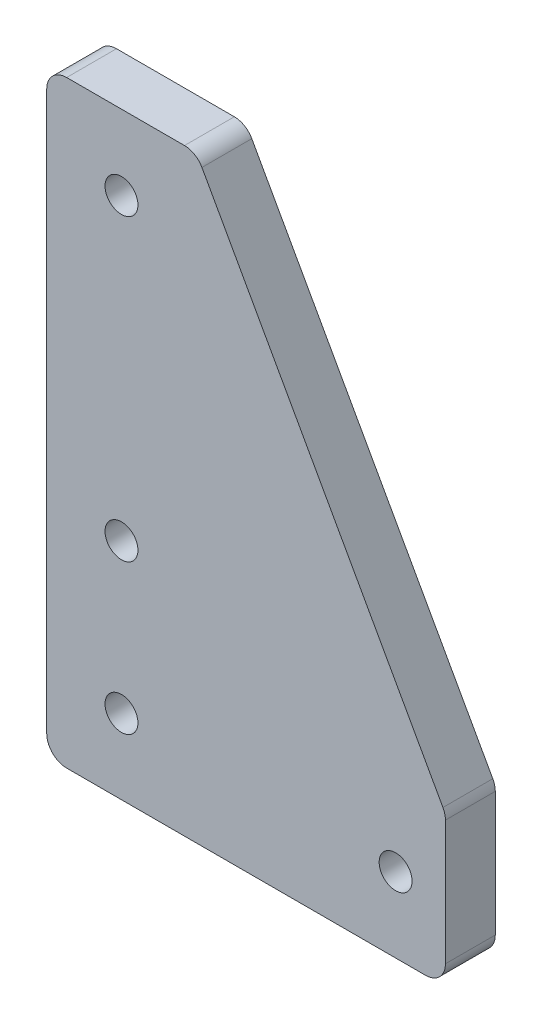
ISO-10303-21;
HEADER;
FILE_DESCRIPTION(('STEP AP214'),'2;1');
FILE_NAME('part.step','',(''),(''),'','','');
FILE_SCHEMA(('AUTOMOTIVE_DESIGN { 1 0 10303 214 1 1 1 1 }'));
ENDSEC;
DATA;
#1=APPLICATION_CONTEXT('core data for automotive mechanical design processes');
#2=APPLICATION_PROTOCOL_DEFINITION('international standard','automotive_design',2000,#1);
#3=PRODUCT_CONTEXT('',#1,'mechanical');
#4=PRODUCT('Part','Part','',(#3));
#5=PRODUCT_RELATED_PRODUCT_CATEGORY('part','',(#4));
#6=PRODUCT_DEFINITION_FORMATION('','',#4);
#7=PRODUCT_DEFINITION_CONTEXT('part definition',#1,'design');
#8=PRODUCT_DEFINITION('design','',#6,#7);
#9=PRODUCT_DEFINITION_SHAPE('','',#8);
#10=(LENGTH_UNIT() NAMED_UNIT(*) SI_UNIT(.MILLI.,.METRE.));
#11=(NAMED_UNIT(*) PLANE_ANGLE_UNIT() SI_UNIT($,.RADIAN.));
#12=(NAMED_UNIT(*) SI_UNIT($,.STERADIAN.) SOLID_ANGLE_UNIT());
#13=UNCERTAINTY_MEASURE_WITH_UNIT(LENGTH_MEASURE(1.E-05),#10,'distance_accuracy_value','');
#14=(GEOMETRIC_REPRESENTATION_CONTEXT(3) GLOBAL_UNCERTAINTY_ASSIGNED_CONTEXT((#13)) GLOBAL_UNIT_ASSIGNED_CONTEXT((#10,
#11,#12)) REPRESENTATION_CONTEXT('',''));
#15=CARTESIAN_POINT('',(0.,0.,0.));
#16=DIRECTION('',(0.,0.,1.));
#17=DIRECTION('',(1.,0.,0.));
#18=AXIS2_PLACEMENT_3D('',#15,#16,#17);
#19=CARTESIAN_POINT('',(0.,0.,5.));
#20=DIRECTION('',(0.,0.,1.));
#21=DIRECTION('',(1.,0.,0.));
#22=AXIS2_PLACEMENT_3D('',#19,#20,#21);
#23=PLANE('',#22);
#24=CARTESIAN_POINT('',(7.50000000000001,22.5,5.));
#25=DIRECTION('',(0.,0.,1.));
#26=DIRECTION('',(1.,0.,0.));
#27=AXIS2_PLACEMENT_3D('',#24,#25,#26);
#28=CIRCLE('',#27,1.65);
#29=CARTESIAN_POINT('',(9.15000000000001,22.5,5.));
#30=VERTEX_POINT('',#29);
#31=EDGE_CURVE('E214',#30,#30,#28,.T.);
#32=ORIENTED_EDGE('',*,*,#31,.F.);
#33=EDGE_LOOP('',(#32));
#34=FACE_BOUND('',#33,.T.);
#35=CARTESIAN_POINT('',(35.,7.5,5.));
#36=DIRECTION('',(0.,0.,1.));
#37=DIRECTION('',(1.,0.,0.));
#38=AXIS2_PLACEMENT_3D('',#35,#36,#37);
#39=CIRCLE('',#38,1.65);
#40=CARTESIAN_POINT('',(36.65,7.5,5.));
#41=VERTEX_POINT('',#40);
#42=EDGE_CURVE('E144',#41,#41,#39,.T.);
#43=ORIENTED_EDGE('',*,*,#42,.F.);
#44=EDGE_LOOP('',(#43));
#45=FACE_BOUND('',#44,.T.);
#46=DIRECTION('',(0.,-1.,0.));
#47=VECTOR('',#46,1.);
#48=CARTESIAN_POINT('',(0.,60.,5.));
#49=LINE('',#48,#47);
#50=CARTESIAN_POINT('',(0.,58.,5.));
#51=VERTEX_POINT('',#50);
#52=CARTESIAN_POINT('',(0.,2.,5.));
#53=VERTEX_POINT('',#52);
#54=EDGE_CURVE('E152',#51,#53,#49,.T.);
#55=ORIENTED_EDGE('',*,*,#54,.T.);
#56=CARTESIAN_POINT('',(2.,2.,5.));
#57=DIRECTION('',(0.,0.,1.));
#58=DIRECTION('',(1.,0.,0.));
#59=AXIS2_PLACEMENT_3D('',#56,#57,#58);
#60=CIRCLE('',#59,2.);
#61=CARTESIAN_POINT('',(2.,0.,5.));
#62=VERTEX_POINT('',#61);
#63=EDGE_CURVE('E171',#53,#62,#60,.T.);
#64=ORIENTED_EDGE('',*,*,#63,.T.);
#65=DIRECTION('',(1.,0.,0.));
#66=VECTOR('',#65,1.);
#67=CARTESIAN_POINT('',(0.,0.,5.));
#68=LINE('',#67,#66);
#69=CARTESIAN_POINT('',(38.,0.,5.));
#70=VERTEX_POINT('',#69);
#71=EDGE_CURVE('E131',#62,#70,#68,.T.);
#72=ORIENTED_EDGE('',*,*,#71,.T.);
#73=CARTESIAN_POINT('',(38.,2.,5.));
#74=DIRECTION('',(0.,0.,1.));
#75=DIRECTION('',(1.,0.,0.));
#76=AXIS2_PLACEMENT_3D('',#73,#74,#75);
#77=CIRCLE('',#76,2.);
#78=CARTESIAN_POINT('',(40.,2.,5.));
#79=VERTEX_POINT('',#78);
#80=EDGE_CURVE('E169',#70,#79,#77,.T.);
#81=ORIENTED_EDGE('',*,*,#80,.T.);
#82=DIRECTION('',(0.,1.,0.));
#83=VECTOR('',#82,1.);
#84=CARTESIAN_POINT('',(40.,0.,5.));
#85=LINE('',#84,#83);
#86=CARTESIAN_POINT('',(40.,14.4817479436052,5.));
#87=VERTEX_POINT('',#86);
#88=EDGE_CURVE('E197',#79,#87,#85,.T.);
#89=ORIENTED_EDGE('',*,*,#88,.T.);
#90=CARTESIAN_POINT('',(38.,14.4817479436052,5.));
#91=DIRECTION('',(0.,0.,1.));
#92=DIRECTION('',(1.,0.,0.));
#93=AXIS2_PLACEMENT_3D('',#90,#91,#92);
#94=CIRCLE('',#93,2.);
#95=CARTESIAN_POINT('',(39.7483145522431,15.4530338059625,5.));
#96=VERTEX_POINT('',#95);
#97=EDGE_CURVE('E167',#87,#96,#94,.T.);
#98=ORIENTED_EDGE('',*,*,#97,.T.);
#99=DIRECTION('',(-0.485642931178632,0.874157276121538,0.));
#100=VECTOR('',#99,1.);
#101=CARTESIAN_POINT('',(40.,15.,5.));
#102=LINE('',#101,#100);
#103=CARTESIAN_POINT('',(15.571507854246,58.9712858623573,5.));
#104=VERTEX_POINT('',#103);
#105=EDGE_CURVE('E188',#96,#104,#102,.T.);
#106=ORIENTED_EDGE('',*,*,#105,.T.);
#107=CARTESIAN_POINT('',(13.8231933020029,58.,5.));
#108=DIRECTION('',(0.,0.,1.));
#109=DIRECTION('',(1.,0.,0.));
#110=AXIS2_PLACEMENT_3D('',#107,#108,#109);
#111=CIRCLE('',#110,2.);
#112=CARTESIAN_POINT('',(13.8231933020029,60.,5.));
#113=VERTEX_POINT('',#112);
#114=EDGE_CURVE('E54',#104,#113,#111,.T.);
#115=ORIENTED_EDGE('',*,*,#114,.T.);
#116=DIRECTION('',(-1.,0.,0.));
#117=VECTOR('',#116,1.);
#118=CARTESIAN_POINT('',(15.,60.,5.));
#119=LINE('',#118,#117);
#120=CARTESIAN_POINT('',(2.,60.,5.));
#121=VERTEX_POINT('',#120);
#122=EDGE_CURVE('E153',#113,#121,#119,.T.);
#123=ORIENTED_EDGE('',*,*,#122,.T.);
#124=CARTESIAN_POINT('',(2.,58.,5.));
#125=DIRECTION('',(0.,0.,1.));
#126=DIRECTION('',(1.,0.,0.));
#127=AXIS2_PLACEMENT_3D('',#124,#125,#126);
#128=CIRCLE('',#127,2.);
#129=EDGE_CURVE('E164',#121,#51,#128,.T.);
#130=ORIENTED_EDGE('',*,*,#129,.T.);
#131=EDGE_LOOP('',(#55,#64,#72,#81,#89,#98,#106,#115,#123,#130));
#132=FACE_BOUND('',#131,.T.);
#133=CARTESIAN_POINT('',(7.5,7.5,5.));
#134=DIRECTION('',(0.,0.,1.));
#135=DIRECTION('',(1.,0.,0.));
#136=AXIS2_PLACEMENT_3D('',#133,#134,#135);
#137=CIRCLE('',#136,1.65);
#138=CARTESIAN_POINT('',(9.15,7.5,5.));
#139=VERTEX_POINT('',#138);
#140=EDGE_CURVE('E208',#139,#139,#137,.T.);
#141=ORIENTED_EDGE('',*,*,#140,.F.);
#142=EDGE_LOOP('',(#141));
#143=FACE_BOUND('',#142,.T.);
#144=CARTESIAN_POINT('',(7.5,52.5,5.));
#145=DIRECTION('',(0.,0.,1.));
#146=DIRECTION('',(1.,0.,0.));
#147=AXIS2_PLACEMENT_3D('',#144,#145,#146);
#148=CIRCLE('',#147,1.65);
#149=CARTESIAN_POINT('',(9.15,52.5,5.));
#150=VERTEX_POINT('',#149);
#151=EDGE_CURVE('E220',#150,#150,#148,.T.);
#152=ORIENTED_EDGE('',*,*,#151,.F.);
#153=EDGE_LOOP('',(#152));
#154=FACE_BOUND('',#153,.T.);
#155=ADVANCED_FACE('F33',(#34,#45,#132,#143,#154),#23,.T.);
#156=CARTESIAN_POINT('',(0.,0.,0.));
#157=DIRECTION('',(0.,0.,1.));
#158=DIRECTION('',(1.,0.,0.));
#159=AXIS2_PLACEMENT_3D('',#156,#157,#158);
#160=PLANE('',#159);
#161=DIRECTION('',(1.,0.,0.));
#162=VECTOR('',#161,1.);
#163=CARTESIAN_POINT('',(0.,0.,0.));
#164=LINE('',#163,#162);
#165=CARTESIAN_POINT('',(2.,0.,0.));
#166=VERTEX_POINT('',#165);
#167=CARTESIAN_POINT('',(38.,0.,0.));
#168=VERTEX_POINT('',#167);
#169=EDGE_CURVE('E128',#166,#168,#164,.T.);
#170=ORIENTED_EDGE('',*,*,#169,.F.);
#171=CARTESIAN_POINT('',(2.,2.,0.));
#172=DIRECTION('',(0.,0.,1.));
#173=DIRECTION('',(1.,0.,0.));
#174=AXIS2_PLACEMENT_3D('',#171,#172,#173);
#175=CIRCLE('',#174,2.);
#176=CARTESIAN_POINT('',(0.,2.,0.));
#177=VERTEX_POINT('',#176);
#178=EDGE_CURVE('E111',#166,#177,#175,.F.);
#179=ORIENTED_EDGE('',*,*,#178,.T.);
#180=DIRECTION('',(0.,-1.,0.));
#181=VECTOR('',#180,1.);
#182=CARTESIAN_POINT('',(0.,60.,0.));
#183=LINE('',#182,#181);
#184=CARTESIAN_POINT('',(0.,58.,0.));
#185=VERTEX_POINT('',#184);
#186=EDGE_CURVE('E139',#185,#177,#183,.T.);
#187=ORIENTED_EDGE('',*,*,#186,.F.);
#188=CARTESIAN_POINT('',(2.,58.,0.));
#189=DIRECTION('',(0.,0.,1.));
#190=DIRECTION('',(1.,0.,0.));
#191=AXIS2_PLACEMENT_3D('',#188,#189,#190);
#192=CIRCLE('',#191,2.);
#193=CARTESIAN_POINT('',(2.,60.,0.));
#194=VERTEX_POINT('',#193);
#195=EDGE_CURVE('E132',#185,#194,#192,.F.);
#196=ORIENTED_EDGE('',*,*,#195,.T.);
#197=DIRECTION('',(-1.,0.,0.));
#198=VECTOR('',#197,1.);
#199=CARTESIAN_POINT('',(15.,60.,0.));
#200=LINE('',#199,#198);
#201=CARTESIAN_POINT('',(13.8231933020029,60.,0.));
#202=VERTEX_POINT('',#201);
#203=EDGE_CURVE('E150',#202,#194,#200,.T.);
#204=ORIENTED_EDGE('',*,*,#203,.F.);
#205=CARTESIAN_POINT('',(13.8231933020029,58.,0.));
#206=DIRECTION('',(0.,0.,1.));
#207=DIRECTION('',(1.,0.,0.));
#208=AXIS2_PLACEMENT_3D('',#205,#206,#207);
#209=CIRCLE('',#208,2.);
#210=CARTESIAN_POINT('',(15.571507854246,58.9712858623573,0.));
#211=VERTEX_POINT('',#210);
#212=EDGE_CURVE('E156',#202,#211,#209,.F.);
#213=ORIENTED_EDGE('',*,*,#212,.T.);
#214=DIRECTION('',(-0.485642931178632,0.874157276121538,0.));
#215=VECTOR('',#214,1.);
#216=CARTESIAN_POINT('',(40.,15.,0.));
#217=LINE('',#216,#215);
#218=CARTESIAN_POINT('',(39.7483145522431,15.4530338059625,0.));
#219=VERTEX_POINT('',#218);
#220=EDGE_CURVE('E142',#219,#211,#217,.T.);
#221=ORIENTED_EDGE('',*,*,#220,.F.);
#222=CARTESIAN_POINT('',(38.,14.4817479436052,0.));
#223=DIRECTION('',(0.,0.,1.));
#224=DIRECTION('',(1.,0.,0.));
#225=AXIS2_PLACEMENT_3D('',#222,#223,#224);
#226=CIRCLE('',#225,2.);
#227=CARTESIAN_POINT('',(40.,14.4817479436052,0.));
#228=VERTEX_POINT('',#227);
#229=EDGE_CURVE('E158',#219,#228,#226,.F.);
#230=ORIENTED_EDGE('',*,*,#229,.T.);
#231=DIRECTION('',(0.,1.,0.));
#232=VECTOR('',#231,1.);
#233=CARTESIAN_POINT('',(40.,0.,0.));
#234=LINE('',#233,#232);
#235=CARTESIAN_POINT('',(40.,2.,0.));
#236=VERTEX_POINT('',#235);
#237=EDGE_CURVE('E138',#236,#228,#234,.T.);
#238=ORIENTED_EDGE('',*,*,#237,.F.);
#239=CARTESIAN_POINT('',(38.,2.,0.));
#240=DIRECTION('',(0.,0.,1.));
#241=DIRECTION('',(1.,0.,0.));
#242=AXIS2_PLACEMENT_3D('',#239,#240,#241);
#243=CIRCLE('',#242,2.);
#244=EDGE_CURVE('E122',#236,#168,#243,.F.);
#245=ORIENTED_EDGE('',*,*,#244,.T.);
#246=EDGE_LOOP('',(#170,#179,#187,#196,#204,#213,#221,#230,#238,#245));
#247=FACE_BOUND('',#246,.T.);
#248=CARTESIAN_POINT('',(35.,7.5,0.));
#249=DIRECTION('',(0.,0.,1.));
#250=DIRECTION('',(1.,0.,0.));
#251=AXIS2_PLACEMENT_3D('',#248,#249,#250);
#252=CIRCLE('',#251,1.65);
#253=CARTESIAN_POINT('',(36.65,7.5,0.));
#254=VERTEX_POINT('',#253);
#255=EDGE_CURVE('E205',#254,#254,#252,.T.);
#256=ORIENTED_EDGE('',*,*,#255,.T.);
#257=EDGE_LOOP('',(#256));
#258=FACE_BOUND('',#257,.T.);
#259=CARTESIAN_POINT('',(7.5,7.5,0.));
#260=DIRECTION('',(0.,0.,1.));
#261=DIRECTION('',(1.,0.,0.));
#262=AXIS2_PLACEMENT_3D('',#259,#260,#261);
#263=CIRCLE('',#262,1.65);
#264=CARTESIAN_POINT('',(9.15,7.5,0.));
#265=VERTEX_POINT('',#264);
#266=EDGE_CURVE('E211',#265,#265,#263,.T.);
#267=ORIENTED_EDGE('',*,*,#266,.T.);
#268=EDGE_LOOP('',(#267));
#269=FACE_BOUND('',#268,.T.);
#270=CARTESIAN_POINT('',(7.50000000000001,22.5,0.));
#271=DIRECTION('',(0.,0.,1.));
#272=DIRECTION('',(1.,0.,0.));
#273=AXIS2_PLACEMENT_3D('',#270,#271,#272);
#274=CIRCLE('',#273,1.65);
#275=CARTESIAN_POINT('',(9.15000000000001,22.5,0.));
#276=VERTEX_POINT('',#275);
#277=EDGE_CURVE('E217',#276,#276,#274,.T.);
#278=ORIENTED_EDGE('',*,*,#277,.T.);
#279=EDGE_LOOP('',(#278));
#280=FACE_BOUND('',#279,.T.);
#281=CARTESIAN_POINT('',(7.5,52.5,0.));
#282=DIRECTION('',(0.,0.,1.));
#283=DIRECTION('',(1.,0.,0.));
#284=AXIS2_PLACEMENT_3D('',#281,#282,#283);
#285=CIRCLE('',#284,1.65);
#286=CARTESIAN_POINT('',(9.15,52.5,0.));
#287=VERTEX_POINT('',#286);
#288=EDGE_CURVE('E223',#287,#287,#285,.T.);
#289=ORIENTED_EDGE('',*,*,#288,.T.);
#290=EDGE_LOOP('',(#289));
#291=FACE_BOUND('',#290,.T.);
#292=ADVANCED_FACE('F135',(#247,#258,#269,#280,#291),#160,.F.);
#293=CARTESIAN_POINT('',(0.,60.,5.));
#294=DIRECTION('',(1.,0.,0.));
#295=DIRECTION('',(0.,1.,0.));
#296=AXIS2_PLACEMENT_3D('',#293,#294,#295);
#297=PLANE('',#296);
#298=ORIENTED_EDGE('',*,*,#186,.T.);
#299=DIRECTION('',(0.,0.,-1.));
#300=VECTOR('',#299,1.);
#301=CARTESIAN_POINT('',(0.,2.,5.));
#302=LINE('',#301,#300);
#303=EDGE_CURVE('E116',#177,#53,#302,.F.);
#304=ORIENTED_EDGE('',*,*,#303,.T.);
#305=ORIENTED_EDGE('',*,*,#54,.F.);
#306=DIRECTION('',(0.,0.,-1.));
#307=VECTOR('',#306,1.);
#308=CARTESIAN_POINT('',(0.,58.,5.));
#309=LINE('',#308,#307);
#310=EDGE_CURVE('E121',#51,#185,#309,.T.);
#311=ORIENTED_EDGE('',*,*,#310,.T.);
#312=EDGE_LOOP('',(#298,#304,#305,#311));
#313=FACE_BOUND('',#312,.T.);
#314=ADVANCED_FACE('F238',(#313),#297,.F.);
#315=CARTESIAN_POINT('',(0.,0.,5.));
#316=DIRECTION('',(0.,1.,0.));
#317=DIRECTION('',(0.,0.,1.));
#318=AXIS2_PLACEMENT_3D('',#315,#316,#317);
#319=PLANE('',#318);
#320=ORIENTED_EDGE('',*,*,#71,.F.);
#321=DIRECTION('',(0.,0.,-1.));
#322=VECTOR('',#321,1.);
#323=CARTESIAN_POINT('',(2.,0.,5.));
#324=LINE('',#323,#322);
#325=EDGE_CURVE('E115',#62,#166,#324,.T.);
#326=ORIENTED_EDGE('',*,*,#325,.T.);
#327=ORIENTED_EDGE('',*,*,#169,.T.);
#328=DIRECTION('',(0.,0.,-1.));
#329=VECTOR('',#328,1.);
#330=CARTESIAN_POINT('',(38.,0.,5.));
#331=LINE('',#330,#329);
#332=EDGE_CURVE('E133',#168,#70,#331,.F.);
#333=ORIENTED_EDGE('',*,*,#332,.T.);
#334=EDGE_LOOP('',(#320,#326,#327,#333));
#335=FACE_BOUND('',#334,.T.);
#336=ADVANCED_FACE('F127',(#335),#319,.F.);
#337=CARTESIAN_POINT('',(40.,0.,5.));
#338=DIRECTION('',(-1.,0.,0.));
#339=DIRECTION('',(0.,0.,1.));
#340=AXIS2_PLACEMENT_3D('',#337,#338,#339);
#341=PLANE('',#340);
#342=ORIENTED_EDGE('',*,*,#88,.F.);
#343=DIRECTION('',(0.,0.,-1.));
#344=VECTOR('',#343,1.);
#345=CARTESIAN_POINT('',(40.,2.,5.));
#346=LINE('',#345,#344);
#347=EDGE_CURVE('E175',#79,#236,#346,.T.);
#348=ORIENTED_EDGE('',*,*,#347,.T.);
#349=ORIENTED_EDGE('',*,*,#237,.T.);
#350=DIRECTION('',(0.,0.,-1.));
#351=VECTOR('',#350,1.);
#352=CARTESIAN_POINT('',(40.,14.4817479436052,5.));
#353=LINE('',#352,#351);
#354=EDGE_CURVE('E173',#228,#87,#353,.F.);
#355=ORIENTED_EDGE('',*,*,#354,.T.);
#356=EDGE_LOOP('',(#342,#348,#349,#355));
#357=FACE_BOUND('',#356,.T.);
#358=ADVANCED_FACE('F250',(#357),#341,.F.);
#359=CARTESIAN_POINT('',(40.,15.,5.));
#360=DIRECTION('',(-0.874157276121538,-0.485642931178632,0.));
#361=DIRECTION('',(0.485642931178632,-0.874157276121538,0.));
#362=AXIS2_PLACEMENT_3D('',#359,#360,#361);
#363=PLANE('',#362);
#364=ORIENTED_EDGE('',*,*,#105,.F.);
#365=DIRECTION('',(0.,0.,-1.));
#366=VECTOR('',#365,1.);
#367=CARTESIAN_POINT('',(39.7483145522431,15.4530338059625,5.));
#368=LINE('',#367,#366);
#369=EDGE_CURVE('E180',#96,#219,#368,.T.);
#370=ORIENTED_EDGE('',*,*,#369,.T.);
#371=ORIENTED_EDGE('',*,*,#220,.T.);
#372=DIRECTION('',(0.,0.,-1.));
#373=VECTOR('',#372,1.);
#374=CARTESIAN_POINT('',(15.571507854246,58.9712858623573,5.));
#375=LINE('',#374,#373);
#376=EDGE_CURVE('E178',#211,#104,#375,.F.);
#377=ORIENTED_EDGE('',*,*,#376,.T.);
#378=EDGE_LOOP('',(#364,#370,#371,#377));
#379=FACE_BOUND('',#378,.T.);
#380=ADVANCED_FACE('F186',(#379),#363,.F.);
#381=CARTESIAN_POINT('',(15.,60.,5.));
#382=DIRECTION('',(0.,-1.,0.));
#383=DIRECTION('',(0.,0.,-1.));
#384=AXIS2_PLACEMENT_3D('',#381,#382,#383);
#385=PLANE('',#384);
#386=ORIENTED_EDGE('',*,*,#122,.F.);
#387=DIRECTION('',(0.,0.,-1.));
#388=VECTOR('',#387,1.);
#389=CARTESIAN_POINT('',(13.8231933020029,60.,5.));
#390=LINE('',#389,#388);
#391=EDGE_CURVE('E11',#113,#202,#390,.T.);
#392=ORIENTED_EDGE('',*,*,#391,.T.);
#393=ORIENTED_EDGE('',*,*,#203,.T.);
#394=DIRECTION('',(0.,0.,-1.));
#395=VECTOR('',#394,1.);
#396=CARTESIAN_POINT('',(2.,60.,5.));
#397=LINE('',#396,#395);
#398=EDGE_CURVE('E41',#194,#121,#397,.F.);
#399=ORIENTED_EDGE('',*,*,#398,.T.);
#400=EDGE_LOOP('',(#386,#392,#393,#399));
#401=FACE_BOUND('',#400,.T.);
#402=ADVANCED_FACE('F195',(#401),#385,.F.);
#403=CARTESIAN_POINT('',(35.,7.5,5.));
#404=DIRECTION('',(0.,0.,-1.));
#405=DIRECTION('',(-1.,0.,0.));
#406=AXIS2_PLACEMENT_3D('',#403,#404,#405);
#407=CYLINDRICAL_SURFACE('',#406,1.65);
#408=ORIENTED_EDGE('',*,*,#42,.T.);
#409=EDGE_LOOP('',(#408));
#410=FACE_BOUND('',#409,.T.);
#411=ORIENTED_EDGE('',*,*,#255,.F.);
#412=EDGE_LOOP('',(#411));
#413=FACE_BOUND('',#412,.T.);
#414=ADVANCED_FACE('F243',(#410,#413),#407,.F.);
#415=CARTESIAN_POINT('',(7.5,7.5,5.));
#416=DIRECTION('',(0.,0.,-1.));
#417=DIRECTION('',(-1.,0.,0.));
#418=AXIS2_PLACEMENT_3D('',#415,#416,#417);
#419=CYLINDRICAL_SURFACE('',#418,1.65);
#420=ORIENTED_EDGE('',*,*,#140,.T.);
#421=EDGE_LOOP('',(#420));
#422=FACE_BOUND('',#421,.T.);
#423=ORIENTED_EDGE('',*,*,#266,.F.);
#424=EDGE_LOOP('',(#423));
#425=FACE_BOUND('',#424,.T.);
#426=ADVANCED_FACE('F283',(#422,#425),#419,.F.);
#427=CARTESIAN_POINT('',(7.50000000000001,22.5,5.));
#428=DIRECTION('',(0.,0.,-1.));
#429=DIRECTION('',(-1.,0.,0.));
#430=AXIS2_PLACEMENT_3D('',#427,#428,#429);
#431=CYLINDRICAL_SURFACE('',#430,1.65);
#432=ORIENTED_EDGE('',*,*,#31,.T.);
#433=EDGE_LOOP('',(#432));
#434=FACE_BOUND('',#433,.T.);
#435=ORIENTED_EDGE('',*,*,#277,.F.);
#436=EDGE_LOOP('',(#435));
#437=FACE_BOUND('',#436,.T.);
#438=ADVANCED_FACE('F286',(#434,#437),#431,.F.);
#439=CARTESIAN_POINT('',(7.5,52.5,5.));
#440=DIRECTION('',(0.,0.,-1.));
#441=DIRECTION('',(-1.,0.,0.));
#442=AXIS2_PLACEMENT_3D('',#439,#440,#441);
#443=CYLINDRICAL_SURFACE('',#442,1.65);
#444=ORIENTED_EDGE('',*,*,#151,.T.);
#445=EDGE_LOOP('',(#444));
#446=FACE_BOUND('',#445,.T.);
#447=ORIENTED_EDGE('',*,*,#288,.F.);
#448=EDGE_LOOP('',(#447));
#449=FACE_BOUND('',#448,.T.);
#450=ADVANCED_FACE('F229',(#446,#449),#443,.F.);
#451=CARTESIAN_POINT('',(2.,2.,5.));
#452=DIRECTION('',(0.,0.,-1.));
#453=DIRECTION('',(-1.,0.,0.));
#454=AXIS2_PLACEMENT_3D('',#451,#452,#453);
#455=CYLINDRICAL_SURFACE('',#454,2.);
#456=ORIENTED_EDGE('',*,*,#63,.F.);
#457=ORIENTED_EDGE('',*,*,#303,.F.);
#458=ORIENTED_EDGE('',*,*,#178,.F.);
#459=ORIENTED_EDGE('',*,*,#325,.F.);
#460=EDGE_LOOP('',(#456,#457,#458,#459));
#461=FACE_BOUND('',#460,.T.);
#462=ADVANCED_FACE('F114',(#461),#455,.T.);
#463=CARTESIAN_POINT('',(38.,2.,5.));
#464=DIRECTION('',(0.,0.,-1.));
#465=DIRECTION('',(-1.,0.,0.));
#466=AXIS2_PLACEMENT_3D('',#463,#464,#465);
#467=CYLINDRICAL_SURFACE('',#466,2.);
#468=ORIENTED_EDGE('',*,*,#80,.F.);
#469=ORIENTED_EDGE('',*,*,#332,.F.);
#470=ORIENTED_EDGE('',*,*,#244,.F.);
#471=ORIENTED_EDGE('',*,*,#347,.F.);
#472=EDGE_LOOP('',(#468,#469,#470,#471));
#473=FACE_BOUND('',#472,.T.);
#474=ADVANCED_FACE('F261',(#473),#467,.T.);
#475=CARTESIAN_POINT('',(38.,14.4817479436052,5.));
#476=DIRECTION('',(0.,0.,-1.));
#477=DIRECTION('',(-1.,0.,0.));
#478=AXIS2_PLACEMENT_3D('',#475,#476,#477);
#479=CYLINDRICAL_SURFACE('',#478,2.);
#480=ORIENTED_EDGE('',*,*,#97,.F.);
#481=ORIENTED_EDGE('',*,*,#354,.F.);
#482=ORIENTED_EDGE('',*,*,#229,.F.);
#483=ORIENTED_EDGE('',*,*,#369,.F.);
#484=EDGE_LOOP('',(#480,#481,#482,#483));
#485=FACE_BOUND('',#484,.T.);
#486=ADVANCED_FACE('F264',(#485),#479,.T.);
#487=CARTESIAN_POINT('',(13.8231933020029,58.,5.));
#488=DIRECTION('',(0.,0.,-1.));
#489=DIRECTION('',(-1.,0.,0.));
#490=AXIS2_PLACEMENT_3D('',#487,#488,#489);
#491=CYLINDRICAL_SURFACE('',#490,2.);
#492=ORIENTED_EDGE('',*,*,#114,.F.);
#493=ORIENTED_EDGE('',*,*,#376,.F.);
#494=ORIENTED_EDGE('',*,*,#212,.F.);
#495=ORIENTED_EDGE('',*,*,#391,.F.);
#496=EDGE_LOOP('',(#492,#493,#494,#495));
#497=FACE_BOUND('',#496,.T.);
#498=ADVANCED_FACE('F194',(#497),#491,.T.);
#499=CARTESIAN_POINT('',(2.,58.,5.));
#500=DIRECTION('',(0.,0.,-1.));
#501=DIRECTION('',(-1.,0.,0.));
#502=AXIS2_PLACEMENT_3D('',#499,#500,#501);
#503=CYLINDRICAL_SURFACE('',#502,2.);
#504=ORIENTED_EDGE('',*,*,#129,.F.);
#505=ORIENTED_EDGE('',*,*,#398,.F.);
#506=ORIENTED_EDGE('',*,*,#195,.F.);
#507=ORIENTED_EDGE('',*,*,#310,.F.);
#508=EDGE_LOOP('',(#504,#505,#506,#507));
#509=FACE_BOUND('',#508,.T.);
#510=ADVANCED_FACE('F35',(#509),#503,.T.);
#511=CLOSED_SHELL('',(#155,#292,#314,#336,#358,#380,#402,#414,#426,#438,#450,#462,#474,#486,
#498,#510));
#512=MANIFOLD_SOLID_BREP('B2',#511);
#513=ADVANCED_BREP_SHAPE_REPRESENTATION('',(#18,#512),#14);
#514=SHAPE_DEFINITION_REPRESENTATION(#9,#513);
ENDSEC;
END-ISO-10303-21;
